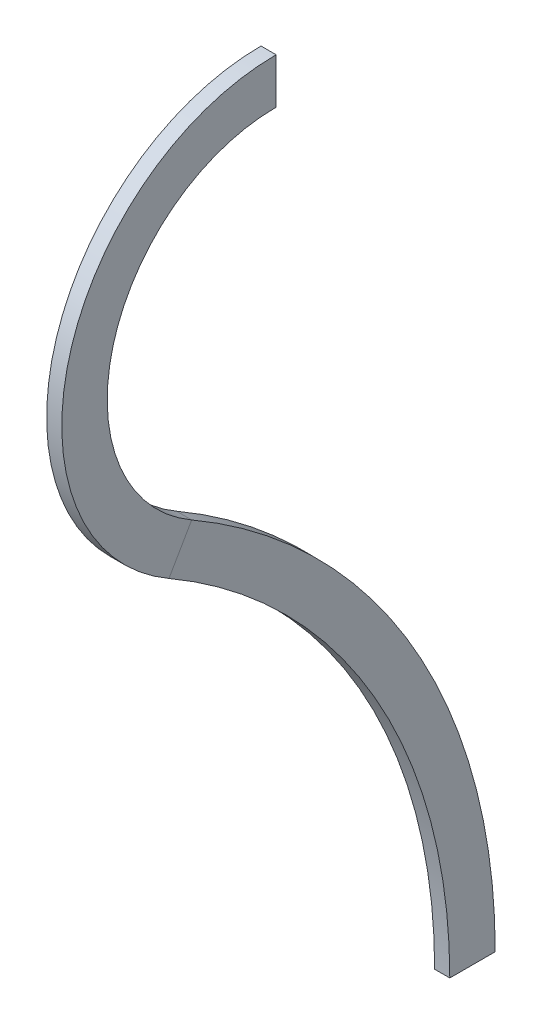
ISO-10303-21;
HEADER;
FILE_DESCRIPTION(('STEP AP214'),'2;1');
FILE_NAME('part.step','',(''),(''),'','','');
FILE_SCHEMA(('AUTOMOTIVE_DESIGN { 1 0 10303 214 1 1 1 1 }'));
ENDSEC;
DATA;
#1=APPLICATION_CONTEXT('core data for automotive mechanical design processes');
#2=APPLICATION_PROTOCOL_DEFINITION('international standard','automotive_design',2000,#1);
#3=PRODUCT_CONTEXT('',#1,'mechanical');
#4=PRODUCT('Part','Part','',(#3));
#5=PRODUCT_RELATED_PRODUCT_CATEGORY('part','',(#4));
#6=PRODUCT_DEFINITION_FORMATION('','',#4);
#7=PRODUCT_DEFINITION_CONTEXT('part definition',#1,'design');
#8=PRODUCT_DEFINITION('design','',#6,#7);
#9=PRODUCT_DEFINITION_SHAPE('','',#8);
#10=(LENGTH_UNIT() NAMED_UNIT(*) SI_UNIT(.MILLI.,.METRE.));
#11=(NAMED_UNIT(*) PLANE_ANGLE_UNIT() SI_UNIT($,.RADIAN.));
#12=(NAMED_UNIT(*) SI_UNIT($,.STERADIAN.) SOLID_ANGLE_UNIT());
#13=UNCERTAINTY_MEASURE_WITH_UNIT(LENGTH_MEASURE(1.E-05),#10,'distance_accuracy_value','');
#14=(GEOMETRIC_REPRESENTATION_CONTEXT(3) GLOBAL_UNCERTAINTY_ASSIGNED_CONTEXT((#13)) GLOBAL_UNIT_ASSIGNED_CONTEXT((#10,
#11,#12)) REPRESENTATION_CONTEXT('',''));
#15=CARTESIAN_POINT('',(0.,0.,0.));
#16=DIRECTION('',(0.,0.,1.));
#17=DIRECTION('',(1.,0.,0.));
#18=AXIS2_PLACEMENT_3D('',#15,#16,#17);
#19=CARTESIAN_POINT('',(0.,140.,0.));
#20=DIRECTION('',(0.,0.,1.));
#21=DIRECTION('',(0.,-1.,0.));
#22=AXIS2_PLACEMENT_3D('',#19,#20,#21);
#23=PLANE('',#22);
#24=DIRECTION('',(0.,1.,0.));
#25=VECTOR('',#24,1.);
#26=CARTESIAN_POINT('',(0.,117.065782214345,0.));
#27=LINE('',#26,#25);
#28=CARTESIAN_POINT('',(0.,111.065782214345,0.));
#29=VERTEX_POINT('',#28);
#30=CARTESIAN_POINT('',(0.,117.065782214345,0.));
#31=VERTEX_POINT('',#30);
#32=EDGE_CURVE('E91',#29,#31,#27,.T.);
#33=ORIENTED_EDGE('',*,*,#32,.T.);
#34=DIRECTION('',(1.,0.,0.));
#35=VECTOR('',#34,1.);
#36=CARTESIAN_POINT('',(0.,117.065782214345,0.));
#37=LINE('',#36,#35);
#38=CARTESIAN_POINT('',(2.,117.065782214345,0.));
#39=VERTEX_POINT('',#38);
#40=EDGE_CURVE('E114',#31,#39,#37,.T.);
#41=ORIENTED_EDGE('',*,*,#40,.T.);
#42=DIRECTION('',(0.,-1.,0.));
#43=VECTOR('',#42,1.);
#44=CARTESIAN_POINT('',(2.,117.065782214345,0.));
#45=LINE('',#44,#43);
#46=CARTESIAN_POINT('',(2.,111.065782214345,0.));
#47=VERTEX_POINT('',#46);
#48=EDGE_CURVE('E105',#39,#47,#45,.T.);
#49=ORIENTED_EDGE('',*,*,#48,.T.);
#50=DIRECTION('',(-1.,0.,0.));
#51=VECTOR('',#50,1.);
#52=CARTESIAN_POINT('',(0.,111.065782214345,0.));
#53=LINE('',#52,#51);
#54=EDGE_CURVE('E98',#47,#29,#53,.T.);
#55=ORIENTED_EDGE('',*,*,#54,.T.);
#56=EDGE_LOOP('',(#33,#41,#49,#55));
#57=FACE_BOUND('',#56,.T.);
#58=ADVANCED_FACE('F34',(#57),#23,.F.);
#59=CARTESIAN_POINT('',(0.,0.,0.));
#60=DIRECTION('',(0.,-1.,0.));
#61=DIRECTION('',(0.,0.,-1.));
#62=AXIS2_PLACEMENT_3D('',#59,#60,#61);
#63=PLANE('',#62);
#64=DIRECTION('',(0.,0.,1.));
#65=VECTOR('',#64,1.);
#66=CARTESIAN_POINT('',(0.,0.,-22.9342177856549));
#67=LINE('',#66,#65);
#68=CARTESIAN_POINT('',(0.,0.,-28.9342177856549));
#69=VERTEX_POINT('',#68);
#70=CARTESIAN_POINT('',(0.,0.,-22.9342177856549));
#71=VERTEX_POINT('',#70);
#72=EDGE_CURVE('E48',#69,#71,#67,.T.);
#73=ORIENTED_EDGE('',*,*,#72,.F.);
#74=DIRECTION('',(-1.,0.,0.));
#75=VECTOR('',#74,1.);
#76=CARTESIAN_POINT('',(0.,0.,-28.9342177856549));
#77=LINE('',#76,#75);
#78=CARTESIAN_POINT('',(2.,0.,-28.9342177856549));
#79=VERTEX_POINT('',#78);
#80=EDGE_CURVE('E57',#79,#69,#77,.T.);
#81=ORIENTED_EDGE('',*,*,#80,.F.);
#82=DIRECTION('',(0.,0.,-1.));
#83=VECTOR('',#82,1.);
#84=CARTESIAN_POINT('',(2.,0.,-22.9342177856549));
#85=LINE('',#84,#83);
#86=CARTESIAN_POINT('',(2.,0.,-22.9342177856549));
#87=VERTEX_POINT('',#86);
#88=EDGE_CURVE('E126',#87,#79,#85,.T.);
#89=ORIENTED_EDGE('',*,*,#88,.F.);
#90=DIRECTION('',(1.,0.,0.));
#91=VECTOR('',#90,1.);
#92=CARTESIAN_POINT('',(0.,0.,-22.9342177856549));
#93=LINE('',#92,#91);
#94=EDGE_CURVE('E11',#71,#87,#93,.T.);
#95=ORIENTED_EDGE('',*,*,#94,.F.);
#96=EDGE_LOOP('',(#73,#81,#89,#95));
#97=FACE_BOUND('',#96,.T.);
#98=ADVANCED_FACE('F165',(#97),#63,.T.);
#99=CARTESIAN_POINT('',(2.,117.065782214345,0.));
#100=DIRECTION('',(-1.,0.,0.));
#101=DIRECTION('',(0.,0.,1.));
#102=AXIS2_PLACEMENT_3D('',#99,#100,#101);
#103=PLANE('',#102);
#104=CARTESIAN_POINT('',(2.,88.7564434701786,0.));
#105=DIRECTION('',(1.,0.,0.));
#106=DIRECTION('',(0.,1.,0.));
#107=AXIS2_PLACEMENT_3D('',#104,#105,#106);
#108=CIRCLE('',#107,22.3093387441666);
#109=CARTESIAN_POINT('',(2.,69.4359893760979,11.1546693720833));
#110=VERTEX_POINT('',#109);
#111=EDGE_CURVE('E111',#47,#110,#108,.T.);
#112=ORIENTED_EDGE('',*,*,#111,.F.);
#113=ORIENTED_EDGE('',*,*,#48,.F.);
#114=CARTESIAN_POINT('',(2.,88.7564434701786,0.));
#115=DIRECTION('',(1.,0.,0.));
#116=DIRECTION('',(0.,1.,0.));
#117=AXIS2_PLACEMENT_3D('',#114,#115,#116);
#118=CIRCLE('',#117,28.3093387441666);
#119=CARTESIAN_POINT('',(2.,64.2398369533913,14.1546693720833));
#120=VERTEX_POINT('',#119);
#121=EDGE_CURVE('E110',#39,#120,#118,.T.);
#122=ORIENTED_EDGE('',*,*,#121,.T.);
#123=DIRECTION('',(0.,0.866025403784439,-0.5));
#124=VECTOR('',#123,1.);
#125=CARTESIAN_POINT('',(2.,64.2398369533913,14.1546693720833));
#126=LINE('',#125,#124);
#127=EDGE_CURVE('E121',#120,#110,#126,.T.);
#128=ORIENTED_EDGE('',*,*,#127,.T.);
#129=EDGE_LOOP('',(#112,#113,#122,#128));
#130=FACE_BOUND('',#129,.T.);
#131=ADVANCED_FACE('F107',(#130),#103,.F.);
#132=CARTESIAN_POINT('',(0.,88.7564434701786,0.));
#133=DIRECTION('',(1.,0.,0.));
#134=DIRECTION('',(0.,0.,-1.));
#135=AXIS2_PLACEMENT_3D('',#132,#133,#134);
#136=CYLINDRICAL_SURFACE('',#135,22.3093387441666);
#137=CARTESIAN_POINT('',(0.,88.7564434701786,0.));
#138=DIRECTION('',(1.,0.,0.));
#139=DIRECTION('',(0.,1.,0.));
#140=AXIS2_PLACEMENT_3D('',#137,#138,#139);
#141=CIRCLE('',#140,22.3093387441666);
#142=CARTESIAN_POINT('',(0.,69.4359893760979,11.1546693720833));
#143=VERTEX_POINT('',#142);
#144=EDGE_CURVE('E136',#29,#143,#141,.T.);
#145=ORIENTED_EDGE('',*,*,#144,.F.);
#146=ORIENTED_EDGE('',*,*,#54,.F.);
#147=ORIENTED_EDGE('',*,*,#111,.T.);
#148=DIRECTION('',(-1.,0.,0.));
#149=VECTOR('',#148,1.);
#150=CARTESIAN_POINT('',(0.,69.4359893760979,11.1546693720833));
#151=LINE('',#150,#149);
#152=EDGE_CURVE('E133',#110,#143,#151,.T.);
#153=ORIENTED_EDGE('',*,*,#152,.T.);
#154=EDGE_LOOP('',(#145,#146,#147,#153));
#155=FACE_BOUND('',#154,.T.);
#156=ADVANCED_FACE('F172',(#155),#136,.F.);
#157=CARTESIAN_POINT('',(0.,117.065782214345,0.));
#158=DIRECTION('',(1.,0.,0.));
#159=DIRECTION('',(0.,0.,-1.));
#160=AXIS2_PLACEMENT_3D('',#157,#158,#159);
#161=PLANE('',#160);
#162=CARTESIAN_POINT('',(0.,88.7564434701786,0.));
#163=DIRECTION('',(1.,0.,0.));
#164=DIRECTION('',(0.,1.,0.));
#165=AXIS2_PLACEMENT_3D('',#162,#163,#164);
#166=CIRCLE('',#165,28.3093387441666);
#167=CARTESIAN_POINT('',(0.,64.2398369533913,14.1546693720833));
#168=VERTEX_POINT('',#167);
#169=EDGE_CURVE('E144',#31,#168,#166,.T.);
#170=ORIENTED_EDGE('',*,*,#169,.F.);
#171=ORIENTED_EDGE('',*,*,#32,.F.);
#172=ORIENTED_EDGE('',*,*,#144,.T.);
#173=DIRECTION('',(0.,-0.866025403784439,0.5));
#174=VECTOR('',#173,1.);
#175=CARTESIAN_POINT('',(0.,64.2398369533913,14.1546693720833));
#176=LINE('',#175,#174);
#177=EDGE_CURVE('E138',#143,#168,#176,.T.);
#178=ORIENTED_EDGE('',*,*,#177,.T.);
#179=EDGE_LOOP('',(#170,#171,#172,#178));
#180=FACE_BOUND('',#179,.T.);
#181=ADVANCED_FACE('F150',(#180),#161,.F.);
#182=CARTESIAN_POINT('',(0.,88.7564434701786,0.));
#183=DIRECTION('',(1.,0.,0.));
#184=DIRECTION('',(0.,0.,-1.));
#185=AXIS2_PLACEMENT_3D('',#182,#183,#184);
#186=CYLINDRICAL_SURFACE('',#185,28.3093387441666);
#187=DIRECTION('',(1.,0.,0.));
#188=VECTOR('',#187,1.);
#189=CARTESIAN_POINT('',(0.,64.2398369533913,14.1546693720833));
#190=LINE('',#189,#188);
#191=EDGE_CURVE('E120',#168,#120,#190,.T.);
#192=ORIENTED_EDGE('',*,*,#191,.T.);
#193=ORIENTED_EDGE('',*,*,#121,.F.);
#194=ORIENTED_EDGE('',*,*,#40,.F.);
#195=ORIENTED_EDGE('',*,*,#169,.T.);
#196=EDGE_LOOP('',(#192,#193,#194,#195));
#197=FACE_BOUND('',#196,.T.);
#198=ADVANCED_FACE('F119',(#197),#186,.T.);
#199=CARTESIAN_POINT('',(2.,64.2398369533912,14.1546693720833));
#200=DIRECTION('',(-1.,0.,0.));
#201=DIRECTION('',(0.,0.,1.));
#202=AXIS2_PLACEMENT_3D('',#199,#200,#201);
#203=PLANE('',#202);
#204=CARTESIAN_POINT('',(2.,0.,51.2435565298214));
#205=DIRECTION('',(-1.,0.,0.));
#206=DIRECTION('',(0.,0.866025403784439,-0.5));
#207=AXIS2_PLACEMENT_3D('',#204,#205,#206);
#208=CIRCLE('',#207,80.1777743154762);
#209=EDGE_CURVE('E81',#110,#79,#208,.T.);
#210=ORIENTED_EDGE('',*,*,#209,.F.);
#211=ORIENTED_EDGE('',*,*,#127,.F.);
#212=CARTESIAN_POINT('',(2.,0.,51.2435565298214));
#213=DIRECTION('',(-1.,0.,0.));
#214=DIRECTION('',(0.,0.866025403784439,-0.5));
#215=AXIS2_PLACEMENT_3D('',#212,#213,#214);
#216=CIRCLE('',#215,74.1777743154762);
#217=EDGE_CURVE('E128',#120,#87,#216,.T.);
#218=ORIENTED_EDGE('',*,*,#217,.T.);
#219=ORIENTED_EDGE('',*,*,#88,.T.);
#220=EDGE_LOOP('',(#210,#211,#218,#219));
#221=FACE_BOUND('',#220,.T.);
#222=ADVANCED_FACE('F160',(#221),#203,.F.);
#223=CARTESIAN_POINT('',(0.,0.,51.2435565298214));
#224=DIRECTION('',(-1.,0.,0.));
#225=DIRECTION('',(0.,0.,1.));
#226=AXIS2_PLACEMENT_3D('',#223,#224,#225);
#227=CYLINDRICAL_SURFACE('',#226,80.1777743154762);
#228=CARTESIAN_POINT('',(0.,0.,51.2435565298214));
#229=DIRECTION('',(-1.,0.,0.));
#230=DIRECTION('',(0.,0.866025403784439,-0.5));
#231=AXIS2_PLACEMENT_3D('',#228,#229,#230);
#232=CIRCLE('',#231,80.1777743154762);
#233=EDGE_CURVE('E76',#143,#69,#232,.T.);
#234=ORIENTED_EDGE('',*,*,#233,.F.);
#235=ORIENTED_EDGE('',*,*,#152,.F.);
#236=ORIENTED_EDGE('',*,*,#209,.T.);
#237=ORIENTED_EDGE('',*,*,#80,.T.);
#238=EDGE_LOOP('',(#234,#235,#236,#237));
#239=FACE_BOUND('',#238,.T.);
#240=ADVANCED_FACE('F153',(#239),#227,.T.);
#241=CARTESIAN_POINT('',(0.,64.2398369533912,14.1546693720833));
#242=DIRECTION('',(1.,0.,0.));
#243=DIRECTION('',(0.,0.,-1.));
#244=AXIS2_PLACEMENT_3D('',#241,#242,#243);
#245=PLANE('',#244);
#246=CARTESIAN_POINT('',(0.,0.,51.2435565298214));
#247=DIRECTION('',(-1.,0.,0.));
#248=DIRECTION('',(0.,0.866025403784439,-0.5));
#249=AXIS2_PLACEMENT_3D('',#246,#247,#248);
#250=CIRCLE('',#249,74.1777743154762);
#251=EDGE_CURVE('E41',#168,#71,#250,.T.);
#252=ORIENTED_EDGE('',*,*,#251,.F.);
#253=ORIENTED_EDGE('',*,*,#177,.F.);
#254=ORIENTED_EDGE('',*,*,#233,.T.);
#255=ORIENTED_EDGE('',*,*,#72,.T.);
#256=EDGE_LOOP('',(#252,#253,#254,#255));
#257=FACE_BOUND('',#256,.T.);
#258=ADVANCED_FACE('F151',(#257),#245,.F.);
#259=CARTESIAN_POINT('',(0.,0.,51.2435565298214));
#260=DIRECTION('',(-1.,0.,0.));
#261=DIRECTION('',(0.,0.,1.));
#262=AXIS2_PLACEMENT_3D('',#259,#260,#261);
#263=CYLINDRICAL_SURFACE('',#262,74.1777743154762);
#264=ORIENTED_EDGE('',*,*,#94,.T.);
#265=ORIENTED_EDGE('',*,*,#217,.F.);
#266=ORIENTED_EDGE('',*,*,#191,.F.);
#267=ORIENTED_EDGE('',*,*,#251,.T.);
#268=EDGE_LOOP('',(#264,#265,#266,#267));
#269=FACE_BOUND('',#268,.T.);
#270=ADVANCED_FACE('F148',(#269),#263,.F.);
#271=CLOSED_SHELL('',(#58,#98,#131,#156,#181,#198,#222,#240,#258,#270));
#272=MANIFOLD_SOLID_BREP('B2',#271);
#273=ADVANCED_BREP_SHAPE_REPRESENTATION('',(#18,#272),#14);
#274=SHAPE_DEFINITION_REPRESENTATION(#9,#273);
ENDSEC;
END-ISO-10303-21;
